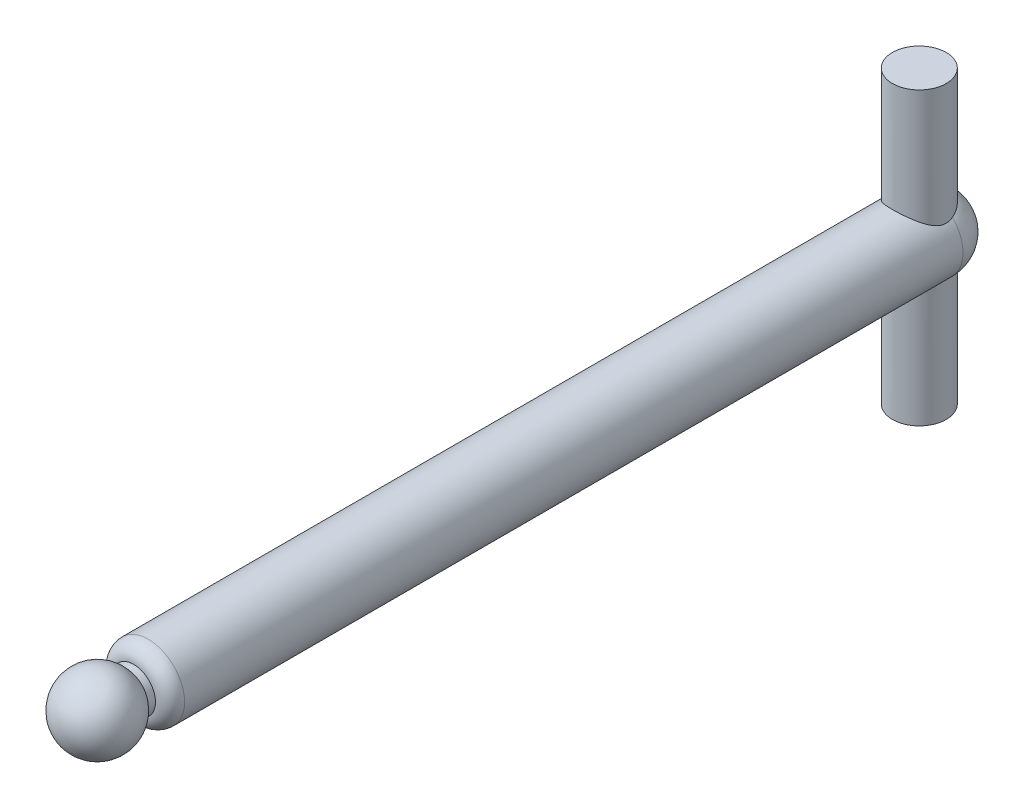
ISO-10303-21;
HEADER;
FILE_DESCRIPTION(('STEP AP214'),'2;1');
FILE_NAME('part.step','',(''),(''),'','','');
FILE_SCHEMA(('AUTOMOTIVE_DESIGN { 1 0 10303 214 1 1 1 1 }'));
ENDSEC;
DATA;
#1=APPLICATION_CONTEXT('core data for automotive mechanical design processes');
#2=APPLICATION_PROTOCOL_DEFINITION('international standard','automotive_design',2000,#1);
#3=PRODUCT_CONTEXT('',#1,'mechanical');
#4=PRODUCT('Part','Part','',(#3));
#5=PRODUCT_RELATED_PRODUCT_CATEGORY('part','',(#4));
#6=PRODUCT_DEFINITION_FORMATION('','',#4);
#7=PRODUCT_DEFINITION_CONTEXT('part definition',#1,'design');
#8=PRODUCT_DEFINITION('design','',#6,#7);
#9=PRODUCT_DEFINITION_SHAPE('','',#8);
#10=(LENGTH_UNIT() NAMED_UNIT(*) SI_UNIT(.MILLI.,.METRE.));
#11=(NAMED_UNIT(*) PLANE_ANGLE_UNIT() SI_UNIT($,.RADIAN.));
#12=(NAMED_UNIT(*) SI_UNIT($,.STERADIAN.) SOLID_ANGLE_UNIT());
#13=UNCERTAINTY_MEASURE_WITH_UNIT(LENGTH_MEASURE(1.E-05),#10,'distance_accuracy_value','');
#14=(GEOMETRIC_REPRESENTATION_CONTEXT(3) GLOBAL_UNCERTAINTY_ASSIGNED_CONTEXT((#13)) GLOBAL_UNIT_ASSIGNED_CONTEXT((#10,
#11,#12)) REPRESENTATION_CONTEXT('',''));
#15=CARTESIAN_POINT('',(0.,0.,0.));
#16=DIRECTION('',(0.,0.,1.));
#17=DIRECTION('',(1.,0.,0.));
#18=AXIS2_PLACEMENT_3D('',#15,#16,#17);
#19=CARTESIAN_POINT('',(0.,0.,59.5));
#20=DIRECTION('',(0.,0.,-1.));
#21=DIRECTION('',(1.,0.,0.));
#22=AXIS2_PLACEMENT_3D('',#19,#20,#21);
#23=SPHERICAL_SURFACE('',#22,2.5);
#24=CARTESIAN_POINT('',(0.,0.,57.5));
#25=DIRECTION('',(0.,0.,1.));
#26=DIRECTION('',(1.,0.,0.));
#27=AXIS2_PLACEMENT_3D('',#24,#25,#26);
#28=CIRCLE('',#27,1.5);
#29=CARTESIAN_POINT('',(1.5,0.,57.5));
#30=VERTEX_POINT('',#29);
#31=EDGE_CURVE('E11',#30,#30,#28,.F.);
#32=ORIENTED_EDGE('',*,*,#31,.F.);
#33=EDGE_LOOP('',(#32));
#34=FACE_BOUND('',#33,.T.);
#35=ADVANCED_FACE('F43',(#34),#23,.T.);
#36=CARTESIAN_POINT('',(0.,0.,54.7490704248776));
#37=DIRECTION('',(0.,0.,-1.));
#38=DIRECTION('',(-1.,0.,0.));
#39=AXIS2_PLACEMENT_3D('',#36,#37,#38);
#40=PLANE('',#39);
#41=CARTESIAN_POINT('',(0.,0.,54.7490704248776));
#42=DIRECTION('',(0.,0.,-1.));
#43=DIRECTION('',(-1.,0.,0.));
#44=AXIS2_PLACEMENT_3D('',#41,#42,#43);
#45=CIRCLE('',#44,1.5);
#46=CARTESIAN_POINT('',(-1.5,0.,54.7490704248776));
#47=VERTEX_POINT('',#46);
#48=EDGE_CURVE('E49',#47,#47,#45,.T.);
#49=ORIENTED_EDGE('',*,*,#48,.T.);
#50=EDGE_LOOP('',(#49));
#51=FACE_BOUND('',#50,.T.);
#52=ADVANCED_FACE('F55',(#51),#40,.T.);
#53=CARTESIAN_POINT('',(0.,0.,57.));
#54=DIRECTION('',(0.,0.,-1.));
#55=DIRECTION('',(-1.,0.,0.));
#56=AXIS2_PLACEMENT_3D('',#53,#54,#55);
#57=CYLINDRICAL_SURFACE('',#56,1.5);
#58=ORIENTED_EDGE('',*,*,#31,.T.);
#59=EDGE_LOOP('',(#58));
#60=FACE_BOUND('',#59,.T.);
#61=ORIENTED_EDGE('',*,*,#48,.F.);
#62=EDGE_LOOP('',(#61));
#63=FACE_BOUND('',#62,.T.);
#64=ADVANCED_FACE('F57',(#60,#63),#57,.T.);
#65=CLOSED_SHELL('',(#35,#52,#64));
#66=MANIFOLD_SOLID_BREP('B2',#65);
#67=CARTESIAN_POINT('',(0.,0.,57.));
#68=DIRECTION('',(0.,0.,-1.));
#69=DIRECTION('',(-1.,0.,0.));
#70=AXIS2_PLACEMENT_3D('',#67,#68,#69);
#71=CYLINDRICAL_SURFACE('',#70,2.5);
#72=CARTESIAN_POINT('',(0.,-2.5,4.85));
#73=CARTESIAN_POINT('',(0.0908037411005618,-2.50000387701624,4.85000414182973));
#74=CARTESIAN_POINT('',(0.181586856565063,-2.49501340434212,4.84327753480377));
#75=CARTESIAN_POINT('',(0.360194310265056,-2.47554724517431,4.81684174873592));
#76=CARTESIAN_POINT('',(0.448017631572467,-2.46106833287443,4.7971281544667));
#77=CARTESIAN_POINT('',(0.617816476306533,-2.42401075779856,4.7460339564));
#78=CARTESIAN_POINT('',(0.699819484177153,-2.40147368869752,4.71471323521834));
#79=CARTESIAN_POINT('',(0.856923811863363,-2.35000506142567,4.64185499930175));
#80=CARTESIAN_POINT('',(0.932024152393716,-2.32107259791315,4.60031603796321));
#81=CARTESIAN_POINT('',(1.08100282258564,-2.25580113417474,4.50416199278347));
#82=CARTESIAN_POINT('',(1.15413751679069,-2.21902623511381,4.44869710084186));
#83=CARTESIAN_POINT('',(1.29069231769546,-2.1424880792677,4.32849700726975));
#84=CARTESIAN_POINT('',(1.3540977041287,-2.10272042737369,4.26374803978792));
#85=CARTESIAN_POINT('',(1.48231472194717,-2.01491899975568,4.1121920365579));
#86=CARTESIAN_POINT('',(1.54492109406323,-1.96680693589834,4.02355561252696));
#87=CARTESIAN_POINT('',(1.65454189706459,-1.87551483927527,3.83478683265235));
#88=CARTESIAN_POINT('',(1.70157864027352,-1.83232780733836,3.73467120693063));
#89=CARTESIAN_POINT('',(1.76501686619427,-1.77086778102456,3.55922310480562));
#90=CARTESIAN_POINT('',(1.78639994566694,-1.74910566538276,3.48693105572161));
#91=CARTESIAN_POINT('',(1.82036398081376,-1.7137333366899,3.33845011099936));
#92=CARTESIAN_POINT('',(1.83296503133245,-1.70010452354241,3.26227054259241));
#93=CARTESIAN_POINT('',(1.84855248437103,-1.68315264087127,3.10709233533062));
#94=CARTESIAN_POINT('',(1.85145948025082,-1.67991469384006,3.02807574735096));
#95=CARTESIAN_POINT('',(1.84715394119453,-1.68464452723504,2.87063866821601));
#96=CARTESIAN_POINT('',(1.83993519273003,-1.69261918813617,2.79221857278742));
#97=CARTESIAN_POINT('',(1.81481067069801,-1.71954038855883,2.63080964317656));
#98=CARTESIAN_POINT('',(1.79590101842848,-1.73951183908506,2.54815704643441));
#99=CARTESIAN_POINT('',(1.74795837905897,-1.78767691807979,2.38832957068304));
#100=CARTESIAN_POINT('',(1.71890099472936,-1.81589033495432,2.3111684373647));
#101=CARTESIAN_POINT('',(1.63958740487909,-1.88827191133527,2.13595043173789));
#102=CARTESIAN_POINT('',(1.58546481691831,-1.93450956015681,2.04051006784806));
#103=CARTESIAN_POINT('',(1.46208652721486,-2.02938131468566,1.86129289055596));
#104=CARTESIAN_POINT('',(1.39281274078821,-2.07801822999833,1.77753021313445));
#105=CARTESIAN_POINT('',(1.23860828976679,-2.17352568805819,1.62138807552877));
#106=CARTESIAN_POINT('',(1.15344666157652,-2.22035596466481,1.54921029645904));
#107=CARTESIAN_POINT('',(0.969101681735234,-2.30676108056195,1.42014805763366));
#108=CARTESIAN_POINT('',(0.869951047354383,-2.34635236783227,1.36322878762448));
#109=CARTESIAN_POINT('',(0.686437547780426,-2.40532512381139,1.27990965243991));
#110=CARTESIAN_POINT('',(0.604753557128842,-2.42728567387609,1.2494284113037));
#111=CARTESIAN_POINT('',(0.436259723251394,-2.46314287399148,1.20003763216507));
#112=CARTESIAN_POINT('',(0.349453732455603,-2.47704550160282,1.18111951578878));
#113=CARTESIAN_POINT('',(0.1726562398483,-2.49561990796897,1.15590337782855));
#114=CARTESIAN_POINT('',(0.0826529964801484,-2.50025307592049,1.14965814204996));
#115=CARTESIAN_POINT('',(-0.0972746053877477,-2.49972554491027,1.15037074877488));
#116=CARTESIAN_POINT('',(-0.187198966313853,-2.49456515857203,1.15732816983176));
#117=CARTESIAN_POINT('',(-0.358245071277375,-2.47559809437806,1.18309214263269));
#118=CARTESIAN_POINT('',(-0.439557650657773,-2.46237969395701,1.20109299280203));
#119=CARTESIAN_POINT('',(-0.597676583051945,-2.42885176111822,1.24726722438432));
#120=CARTESIAN_POINT('',(-0.674481981775963,-2.40854073328504,1.27544275107729));
#121=CARTESIAN_POINT('',(-0.827805535400965,-2.36043886159826,1.34326022029349));
#122=CARTESIAN_POINT('',(-0.903869992182026,-2.33220123435144,1.38360373297371));
#123=CARTESIAN_POINT('',(-1.04833308326245,-2.27093934183829,1.4733240178569));
#124=CARTESIAN_POINT('',(-1.11672736130087,-2.23791238065133,1.5227058818883));
#125=CARTESIAN_POINT('',(-1.25715775043202,-2.16263828931728,1.63917749908106));
#126=CARTESIAN_POINT('',(-1.32756528352806,-2.11981052291986,1.70785396620858));
#127=CARTESIAN_POINT('',(-1.4565575339626,-2.03334010477991,1.85520939885789));
#128=CARTESIAN_POINT('',(-1.51512976325952,-1.98969664483973,1.93389878837245));
#129=CARTESIAN_POINT('',(-1.6156686884501,-1.90878111419462,2.09425971851787));
#130=CARTESIAN_POINT('',(-1.65857186677125,-1.87127746657761,2.17522477930214));
#131=CARTESIAN_POINT('',(-1.73261717054205,-1.80293495367251,2.34496541981192));
#132=CARTESIAN_POINT('',(-1.76378345509034,-1.77208245435838,2.43372448655538));
#133=CARTESIAN_POINT('',(-1.80662948856402,-1.72823449695806,2.5953441629559));
#134=CARTESIAN_POINT('',(-1.82121897849959,-1.71271191751858,2.66673024725442));
#135=CARTESIAN_POINT('',(-1.84188151212421,-1.69047699322332,2.81202618441482));
#136=CARTESIAN_POINT('',(-1.84796895309747,-1.68374975566162,2.88593155314593));
#137=CARTESIAN_POINT('',(-1.85117366684881,-1.68022763681263,3.0344197784039));
#138=CARTESIAN_POINT('',(-1.84826288222371,-1.68346382238687,3.1090040295376));
#139=CARTESIAN_POINT('',(-1.83365828289283,-1.69935401295355,3.25631306629406));
#140=CARTESIAN_POINT('',(-1.82195242223173,-1.71202093430047,3.32903516007113));
#141=CARTESIAN_POINT('',(-1.78635459996089,-1.7492146223623,3.48980369573146));
#142=CARTESIAN_POINT('',(-1.76004846371157,-1.77600064790375,3.57677723375518));
#143=CARTESIAN_POINT('',(-1.69627237975545,-1.83701003674836,3.74377053384609));
#144=CARTESIAN_POINT('',(-1.65877478462615,-1.87125176130957,3.82377243330833));
#145=CARTESIAN_POINT('',(-1.56107806384767,-1.95403468107918,3.99919926181548));
#146=CARTESIAN_POINT('',(-1.4974440402703,-2.00379991511226,4.09213480402335));
#147=CARTESIAN_POINT('',(-1.3544289055526,-2.103123596557,4.26515616161268));
#148=CARTESIAN_POINT('',(-1.27503826591533,-2.15268190022473,4.34523414837743));
#149=CARTESIAN_POINT('',(-1.10081905959608,-2.24678421861618,4.49119001955959));
#150=CARTESIAN_POINT('',(-1.00593380501705,-2.29130876473617,4.55701361514183));
#151=CARTESIAN_POINT('',(-0.802375361391734,-2.37023800481386,4.67099169726627));
#152=CARTESIAN_POINT('',(-0.693735220592625,-2.40466631988959,4.71918749221087));
#153=CARTESIAN_POINT('',(-0.487957613261007,-2.45373938378234,4.78711184312141));
#154=CARTESIAN_POINT('',(-0.392652250176831,-2.4709210874987,4.81054107315195));
#155=CARTESIAN_POINT('',(-0.198220207953497,-2.49404314441457,4.84197447230654));
#156=CARTESIAN_POINT('',(-0.0990978211568789,-2.49999576885427,4.84999547985252));
#157=CARTESIAN_POINT('',(0.,-2.5,4.85));
#158=B_SPLINE_CURVE_WITH_KNOTS('',3,(#72,#73,#74,#75,#76,#77,#78,#79,#80,#81,#82,#83,#84,#85,
#86,#87,#88,#89,#90,#91,#92,#93,#94,#95,#96,#97,#98,#99,#100,#101,#102,#103,#104,#105,#106,#107,
#108,#109,#110,#111,#112,#113,#114,#115,#116,#117,#118,#119,#120,#121,#122,#123,#124,#125,#126,
#127,#128,#129,#130,#131,#132,#133,#134,#135,#136,#137,#138,#139,#140,#141,#142,#143,#144,#145,
#146,#147,#148,#149,#150,#151,#152,#153,#154,#155,#156,#157),.UNSPECIFIED.,.T.,.F.,(4,2,2,2,2,2,
2,2,2,2,2,2,2,2,2,2,2,2,2,2,2,2,2,2,2,2,2,2,2,2,2,2,2,2,2,2,2,2,2,2,2,2,4),(0.,
0.272006671725052,0.544105866178727,0.814820378481081,1.08557323811005,1.38115533668075,
1.67718032732562,2.03179266962076,2.38589460601553,2.62047932227766,2.8545254888537,
3.09048414291858,3.32658765323392,3.58648972414884,3.84702100424682,4.20237840203124,
4.55816229700147,4.91959079102965,5.28018757822172,5.54880713770459,5.81722717285043,
6.08676297029442,6.35629016393656,6.60816893561277,6.86010084571472,7.13093030443569,
7.40191280938673,7.72254306220105,8.04350988198216,8.33954399458902,8.63496537906834,
8.85756227031097,9.07978175929555,9.302694849889,9.52591380562473,9.80854391608466,
10.091878099134,10.459478396808,10.8273016744564,11.1965021111849,11.5648317471251,
11.8620086531731,12.1588606130305),.UNSPECIFIED.);
#159=CARTESIAN_POINT('',(-1.78115131305569,-1.75428047928488,2.5));
#160=VERTEX_POINT('',#159);
#161=CARTESIAN_POINT('',(1.78115131305569,-1.75428047928488,2.5));
#162=VERTEX_POINT('',#161);
#163=EDGE_CURVE('E118',#160,#162,#158,.T.);
#164=ORIENTED_EDGE('',*,*,#163,.T.);
#165=CARTESIAN_POINT('',(0.,0.,2.5));
#166=DIRECTION('',(0.,0.,-1.));
#167=DIRECTION('',(-1.,0.,0.));
#168=AXIS2_PLACEMENT_3D('',#165,#166,#167);
#169=CIRCLE('',#168,2.5);
#170=CARTESIAN_POINT('',(1.78115131305569,1.75428047928488,2.5));
#171=VERTEX_POINT('',#170);
#172=EDGE_CURVE('E121',#162,#171,#169,.F.);
#173=ORIENTED_EDGE('',*,*,#172,.T.);
#174=CARTESIAN_POINT('',(0.,2.5,4.85));
#175=CARTESIAN_POINT('',(-0.0908037411005616,2.50000387701624,4.85000414182973));
#176=CARTESIAN_POINT('',(-0.181586856565063,2.49501340434212,4.84327753480377));
#177=CARTESIAN_POINT('',(-0.360194310265056,2.47554724517431,4.81684174873592));
#178=CARTESIAN_POINT('',(-0.448017631572467,2.46106833287443,4.7971281544667));
#179=CARTESIAN_POINT('',(-0.617816476306533,2.42401075779856,4.7460339564));
#180=CARTESIAN_POINT('',(-0.699819484177153,2.40147368869752,4.71471323521834));
#181=CARTESIAN_POINT('',(-0.856923811863363,2.35000506142567,4.64185499930175));
#182=CARTESIAN_POINT('',(-0.932024152393715,2.32107259791315,4.60031603796321));
#183=CARTESIAN_POINT('',(-1.08100282258564,2.25580113417474,4.50416199278347));
#184=CARTESIAN_POINT('',(-1.15413751679069,2.21902623511381,4.44869710084186));
#185=CARTESIAN_POINT('',(-1.29069231769546,2.1424880792677,4.32849700726975));
#186=CARTESIAN_POINT('',(-1.3540977041287,2.10272042737369,4.26374803978792));
#187=CARTESIAN_POINT('',(-1.48231472194717,2.01491899975568,4.1121920365579));
#188=CARTESIAN_POINT('',(-1.54492109406323,1.96680693589834,4.02355561252696));
#189=CARTESIAN_POINT('',(-1.65454189706459,1.87551483927527,3.83478683265235));
#190=CARTESIAN_POINT('',(-1.70157864027352,1.83232780733836,3.73467120693063));
#191=CARTESIAN_POINT('',(-1.76501686619427,1.77086778102456,3.55922310480562));
#192=CARTESIAN_POINT('',(-1.78639994566694,1.74910566538276,3.48693105572161));
#193=CARTESIAN_POINT('',(-1.82036398081376,1.7137333366899,3.33845011099936));
#194=CARTESIAN_POINT('',(-1.83296503133245,1.70010452354241,3.26227054259241));
#195=CARTESIAN_POINT('',(-1.84855248437103,1.68315264087127,3.10709233533062));
#196=CARTESIAN_POINT('',(-1.85145948025082,1.67991469384006,3.02807574735096));
#197=CARTESIAN_POINT('',(-1.84715394119453,1.68464452723504,2.87063866821601));
#198=CARTESIAN_POINT('',(-1.83993519273003,1.69261918813617,2.79221857278742));
#199=CARTESIAN_POINT('',(-1.81481067069801,1.71954038855883,2.63080964317656));
#200=CARTESIAN_POINT('',(-1.79590101842848,1.73951183908506,2.54815704643441));
#201=CARTESIAN_POINT('',(-1.74795837905897,1.78767691807979,2.38832957068304));
#202=CARTESIAN_POINT('',(-1.71890099472936,1.81589033495432,2.3111684373647));
#203=CARTESIAN_POINT('',(-1.63958740487909,1.88827191133527,2.13595043173789));
#204=CARTESIAN_POINT('',(-1.58546481691831,1.93450956015681,2.04051006784806));
#205=CARTESIAN_POINT('',(-1.46208652721486,2.02938131468566,1.86129289055596));
#206=CARTESIAN_POINT('',(-1.39281274078821,2.07801822999833,1.77753021313445));
#207=CARTESIAN_POINT('',(-1.23860828976679,2.17352568805819,1.62138807552877));
#208=CARTESIAN_POINT('',(-1.15344666157652,2.22035596466481,1.54921029645904));
#209=CARTESIAN_POINT('',(-0.969101681735234,2.30676108056195,1.42014805763366));
#210=CARTESIAN_POINT('',(-0.869951047354383,2.34635236783227,1.36322878762448));
#211=CARTESIAN_POINT('',(-0.686437547780426,2.40532512381139,1.27990965243991));
#212=CARTESIAN_POINT('',(-0.604753557128842,2.42728567387609,1.2494284113037));
#213=CARTESIAN_POINT('',(-0.436259723251394,2.46314287399148,1.20003763216507));
#214=CARTESIAN_POINT('',(-0.349453732455603,2.47704550160282,1.18111951578878));
#215=CARTESIAN_POINT('',(-0.1726562398483,2.49561990796897,1.15590337782855));
#216=CARTESIAN_POINT('',(-0.0826529964801484,2.50025307592049,1.14965814204996));
#217=CARTESIAN_POINT('',(0.0972746053877477,2.49972554491027,1.15037074877488));
#218=CARTESIAN_POINT('',(0.187198966313853,2.49456515857203,1.15732816983176));
#219=CARTESIAN_POINT('',(0.358245071277375,2.47559809437806,1.18309214263269));
#220=CARTESIAN_POINT('',(0.439557650657773,2.46237969395701,1.20109299280203));
#221=CARTESIAN_POINT('',(0.597676583051945,2.42885176111822,1.24726722438432));
#222=CARTESIAN_POINT('',(0.674481981775963,2.40854073328504,1.27544275107729));
#223=CARTESIAN_POINT('',(0.827805535400965,2.36043886159826,1.34326022029349));
#224=CARTESIAN_POINT('',(0.903869992182026,2.33220123435144,1.38360373297371));
#225=CARTESIAN_POINT('',(1.04833308326245,2.27093934183829,1.4733240178569));
#226=CARTESIAN_POINT('',(1.11672736130087,2.23791238065133,1.5227058818883));
#227=CARTESIAN_POINT('',(1.25715775043202,2.16263828931728,1.63917749908106));
#228=CARTESIAN_POINT('',(1.32756528352806,2.11981052291986,1.70785396620858));
#229=CARTESIAN_POINT('',(1.4565575339626,2.03334010477991,1.85520939885789));
#230=CARTESIAN_POINT('',(1.51512976325952,1.98969664483973,1.93389878837245));
#231=CARTESIAN_POINT('',(1.6156686884501,1.90878111419462,2.09425971851787));
#232=CARTESIAN_POINT('',(1.65857186677125,1.87127746657761,2.17522477930214));
#233=CARTESIAN_POINT('',(1.73261717054205,1.80293495367251,2.34496541981192));
#234=CARTESIAN_POINT('',(1.76378345509034,1.77208245435838,2.43372448655538));
#235=CARTESIAN_POINT('',(1.80662948856402,1.72823449695806,2.5953441629559));
#236=CARTESIAN_POINT('',(1.82121897849959,1.71271191751858,2.66673024725442));
#237=CARTESIAN_POINT('',(1.84188151212421,1.69047699322332,2.81202618441482));
#238=CARTESIAN_POINT('',(1.84796895309747,1.68374975566162,2.88593155314593));
#239=CARTESIAN_POINT('',(1.85117366684881,1.68022763681263,3.0344197784039));
#240=CARTESIAN_POINT('',(1.84826288222371,1.68346382238687,3.1090040295376));
#241=CARTESIAN_POINT('',(1.83365828289283,1.69935401295355,3.25631306629406));
#242=CARTESIAN_POINT('',(1.82195242223173,1.71202093430047,3.32903516007113));
#243=CARTESIAN_POINT('',(1.78635459996089,1.7492146223623,3.48980369573146));
#244=CARTESIAN_POINT('',(1.76004846371157,1.77600064790375,3.57677723375518));
#245=CARTESIAN_POINT('',(1.69627237975545,1.83701003674836,3.74377053384609));
#246=CARTESIAN_POINT('',(1.65877478462615,1.87125176130957,3.82377243330833));
#247=CARTESIAN_POINT('',(1.56107806384767,1.95403468107918,3.99919926181548));
#248=CARTESIAN_POINT('',(1.4974440402703,2.00379991511226,4.09213480402335));
#249=CARTESIAN_POINT('',(1.3544289055526,2.103123596557,4.26515616161268));
#250=CARTESIAN_POINT('',(1.27503826591533,2.15268190022473,4.34523414837743));
#251=CARTESIAN_POINT('',(1.10081905959608,2.24678421861618,4.49119001955959));
#252=CARTESIAN_POINT('',(1.00593380501705,2.29130876473617,4.55701361514183));
#253=CARTESIAN_POINT('',(0.802375361391734,2.37023800481386,4.67099169726627));
#254=CARTESIAN_POINT('',(0.693735220592625,2.40466631988959,4.71918749221087));
#255=CARTESIAN_POINT('',(0.487957613261007,2.45373938378234,4.78711184312141));
#256=CARTESIAN_POINT('',(0.392652250176831,2.4709210874987,4.81054107315195));
#257=CARTESIAN_POINT('',(0.198220207953497,2.49404314441457,4.84197447230654));
#258=CARTESIAN_POINT('',(0.0990978211568788,2.49999576885427,4.84999547985252));
#259=CARTESIAN_POINT('',(0.,2.5,4.85));
#260=B_SPLINE_CURVE_WITH_KNOTS('',3,(#174,#175,#176,#177,#178,#179,#180,#181,#182,#183,#184,
#185,#186,#187,#188,#189,#190,#191,#192,#193,#194,#195,#196,#197,#198,#199,#200,#201,#202,#203,
#204,#205,#206,#207,#208,#209,#210,#211,#212,#213,#214,#215,#216,#217,#218,#219,#220,#221,#222,
#223,#224,#225,#226,#227,#228,#229,#230,#231,#232,#233,#234,#235,#236,#237,#238,#239,#240,#241,
#242,#243,#244,#245,#246,#247,#248,#249,#250,#251,#252,#253,#254,#255,#256,#257,#258,#259),
.UNSPECIFIED.,.T.,.F.,(4,2,2,2,2,2,2,2,2,2,2,2,2,2,2,2,2,2,2,2,2,2,2,2,2,2,2,2,2,2,2,2,2,2,2,2,
2,2,2,2,2,2,4),(0.,0.272006671725051,0.544105866178727,0.814820378481081,1.08557323811005,
1.38115533668075,1.67718032732562,2.03179266962076,2.38589460601553,2.62047932227766,
2.8545254888537,3.09048414291858,3.32658765323392,3.58648972414884,3.84702100424682,
4.20237840203124,4.55816229700147,4.91959079102965,5.28018757822172,5.54880713770459,
5.81722717285043,6.08676297029442,6.35629016393656,6.60816893561277,6.86010084571472,
7.13093030443569,7.40191280938673,7.72254306220105,8.04350988198216,8.33954399458902,
8.63496537906834,8.85756227031097,9.07978175929555,9.302694849889,9.52591380562473,
9.80854391608466,10.091878099134,10.459478396808,10.8273016744564,11.1965021111849,
11.5648317471251,11.8620086531731,12.1588606130305),.UNSPECIFIED.);
#261=CARTESIAN_POINT('',(-1.78115131305569,1.75428047928488,2.5));
#262=VERTEX_POINT('',#261);
#263=EDGE_CURVE('E124',#171,#262,#260,.T.);
#264=ORIENTED_EDGE('',*,*,#263,.T.);
#265=CARTESIAN_POINT('',(0.,0.,2.5));
#266=DIRECTION('',(0.,0.,-1.));
#267=DIRECTION('',(-1.,0.,0.));
#268=AXIS2_PLACEMENT_3D('',#265,#266,#267);
#269=CIRCLE('',#268,2.5);
#270=EDGE_CURVE('E122',#262,#160,#269,.F.);
#271=ORIENTED_EDGE('',*,*,#270,.T.);
#272=EDGE_LOOP('',(#164,#173,#264,#271));
#273=FACE_BOUND('',#272,.T.);
#274=CARTESIAN_POINT('',(0.,0.,56.));
#275=DIRECTION('',(0.,0.,1.));
#276=DIRECTION('',(1.,0.,0.));
#277=AXIS2_PLACEMENT_3D('',#274,#275,#276);
#278=CIRCLE('',#277,2.5);
#279=CARTESIAN_POINT('',(2.5,0.,56.));
#280=VERTEX_POINT('',#279);
#281=EDGE_CURVE('E127',#280,#280,#278,.F.);
#282=ORIENTED_EDGE('',*,*,#281,.T.);
#283=EDGE_LOOP('',(#282));
#284=FACE_BOUND('',#283,.T.);
#285=ADVANCED_FACE('F84',(#273,#284),#71,.T.);
#286=CARTESIAN_POINT('',(0.,0.,57.));
#287=DIRECTION('',(0.,0.,1.));
#288=DIRECTION('',(1.,0.,0.));
#289=AXIS2_PLACEMENT_3D('',#286,#287,#288);
#290=PLANE('',#289);
#291=CARTESIAN_POINT('',(0.,0.,57.));
#292=DIRECTION('',(0.,0.,1.));
#293=DIRECTION('',(1.,0.,0.));
#294=AXIS2_PLACEMENT_3D('',#291,#292,#293);
#295=CIRCLE('',#294,1.5);
#296=CARTESIAN_POINT('',(1.5,0.,57.));
#297=VERTEX_POINT('',#296);
#298=EDGE_CURVE('E123',#297,#297,#295,.T.);
#299=ORIENTED_EDGE('',*,*,#298,.T.);
#300=EDGE_LOOP('',(#299));
#301=FACE_BOUND('',#300,.T.);
#302=ADVANCED_FACE('F140',(#301),#290,.T.);
#303=CARTESIAN_POINT('',(0.,0.,56.));
#304=DIRECTION('',(0.,0.,1.));
#305=DIRECTION('',(1.,0.,0.));
#306=AXIS2_PLACEMENT_3D('',#303,#304,#305);
#307=TOROIDAL_SURFACE('',#306,1.5,1.);
#308=ORIENTED_EDGE('',*,*,#281,.F.);
#309=EDGE_LOOP('',(#308));
#310=FACE_BOUND('',#309,.T.);
#311=ORIENTED_EDGE('',*,*,#298,.F.);
#312=EDGE_LOOP('',(#311));
#313=FACE_BOUND('',#312,.T.);
#314=ADVANCED_FACE('F153',(#310,#313),#307,.T.);
#315=CARTESIAN_POINT('',(0.,10.,3.));
#316=DIRECTION('',(0.,1.,0.));
#317=DIRECTION('',(0.,0.,1.));
#318=AXIS2_PLACEMENT_3D('',#315,#316,#317);
#319=PLANE('',#318);
#320=CARTESIAN_POINT('',(0.,10.,3.));
#321=DIRECTION('',(0.,1.,0.));
#322=DIRECTION('',(0.,0.,1.));
#323=AXIS2_PLACEMENT_3D('',#320,#321,#322);
#324=CIRCLE('',#323,1.85);
#325=CARTESIAN_POINT('',(0.,10.,4.85));
#326=VERTEX_POINT('',#325);
#327=EDGE_CURVE('E174',#326,#326,#324,.T.);
#328=ORIENTED_EDGE('',*,*,#327,.T.);
#329=EDGE_LOOP('',(#328));
#330=FACE_BOUND('',#329,.T.);
#331=ADVANCED_FACE('F156',(#330),#319,.T.);
#332=CARTESIAN_POINT('',(0.,-10.,3.));
#333=DIRECTION('',(0.,1.,0.));
#334=DIRECTION('',(0.,0.,1.));
#335=AXIS2_PLACEMENT_3D('',#332,#333,#334);
#336=CYLINDRICAL_SURFACE('',#335,1.85);
#337=ORIENTED_EDGE('',*,*,#327,.F.);
#338=EDGE_LOOP('',(#337));
#339=FACE_BOUND('',#338,.T.);
#340=ORIENTED_EDGE('',*,*,#263,.F.);
#341=CARTESIAN_POINT('',(1.78115131305569,1.75428047928488,2.5));
#342=CARTESIAN_POINT('',(1.76710058675012,1.76854587312827,2.44994941524433));
#343=CARTESIAN_POINT('',(1.75092225395561,1.78248611378104,2.40042805303476));
#344=CARTESIAN_POINT('',(1.71437249571935,1.80967652664199,2.30275573071063));
#345=CARTESIAN_POINT('',(1.69400055911865,1.82292661448042,2.25460493847022));
#346=CARTESIAN_POINT('',(1.6267078126766,1.8615686513401,2.1127248674637));
#347=CARTESIAN_POINT('',(1.57360100552128,1.88586154162609,2.02153550777989));
#348=CARTESIAN_POINT('',(1.45211214495975,1.93109222551692,1.84889646438568));
#349=CARTESIAN_POINT('',(1.38371030549637,1.95202561237912,1.76745960821967));
#350=CARTESIAN_POINT('',(1.2334670644207,1.99015969948988,1.61712787517141));
#351=CARTESIAN_POINT('',(1.15163478379201,2.00736291472274,1.54822455291677));
#352=CARTESIAN_POINT('',(0.978953771770452,2.03738571991971,1.42677974446236));
#353=CARTESIAN_POINT('',(0.888373638231622,2.05030199466579,1.37388017486995));
#354=CARTESIAN_POINT('',(0.699155081305317,2.07210457875492,1.28400184937293));
#355=CARTESIAN_POINT('',(0.600515789967888,2.08099045335759,1.24702481097885));
#356=CARTESIAN_POINT('',(0.400690139105801,2.09440530317934,1.19101034012447));
#357=CARTESIAN_POINT('',(0.29963099710197,2.09903863276843,1.1715434750478));
#358=CARTESIAN_POINT('',(0.0955943239700594,2.10425315558351,1.14962560375011));
#359=CARTESIAN_POINT('',(-0.0073828350662439,2.10483512672259,1.14717133089228));
#360=CARTESIAN_POINT('',(-0.210972538549858,2.10195735271765,1.15927718855156));
#361=CARTESIAN_POINT('',(-0.311598544150138,2.09854815818487,1.17362451696438));
#362=CARTESIAN_POINT('',(-0.508957749163906,2.08782608747991,1.21851082793729));
#363=CARTESIAN_POINT('',(-0.605690747751336,2.0805130101975,1.24905064465993));
#364=CARTESIAN_POINT('',(-0.792761366953206,2.0620806423645,1.325408269853));
#365=CARTESIAN_POINT('',(-0.883085566328297,2.05095363308856,1.3712570560728));
#366=CARTESIAN_POINT('',(-1.05468669850434,2.02507130178285,1.47675331044046));
#367=CARTESIAN_POINT('',(-1.13596392749522,2.01031609858776,1.53640032664935));
#368=CARTESIAN_POINT('',(-1.28860320967756,1.97713972179692,1.66869774307618));
#369=CARTESIAN_POINT('',(-1.35978683428904,1.95866393083068,1.74154002169259));
#370=CARTESIAN_POINT('',(-1.48893777127461,1.91847281862052,1.89736529126325));
#371=CARTESIAN_POINT('',(-1.54690352471252,1.89675711575551,1.98034947659871));
#372=CARTESIAN_POINT('',(-1.63745696319684,1.85537238923215,2.13542492880248));
#373=CARTESIAN_POINT('',(-1.67282054155944,1.83625494865695,2.20606364786178));
#374=CARTESIAN_POINT('',(-1.73411537163477,1.79642632655997,2.35074972678324));
#375=CARTESIAN_POINT('',(-1.76006216870444,1.77571784068498,2.42479123946031));
#376=CARTESIAN_POINT('',(-1.78115131305569,1.75428047928488,2.5));
#377=B_SPLINE_CURVE_WITH_KNOTS('',3,(#341,#342,#343,#344,#345,#346,#347,#348,#349,#350,#351,
#352,#353,#354,#355,#356,#357,#358,#359,#360,#361,#362,#363,#364,#365,#366,#367,#368,#369,#370,
#371,#372,#373,#374,#375,#376),.UNSPECIFIED.,.F.,.F.,(4,2,2,2,2,2,2,2,2,2,2,2,2,2,2,2,2,4),(0.,
0.161628733817914,0.323277180262845,0.646470798193981,0.970084951881879,1.29348023283485,
1.60898773186136,1.92452925511353,2.23210271213491,2.53961710945491,2.84327840664623,
3.14695534859141,3.45125054381999,3.75553577375676,4.06466472710674,4.37383012076827,
4.61704441861785,4.85985536866121),.UNSPECIFIED.);
#378=EDGE_CURVE('E97',#171,#262,#377,.T.);
#379=ORIENTED_EDGE('',*,*,#378,.T.);
#380=EDGE_LOOP('',(#340,#379));
#381=FACE_BOUND('',#380,.T.);
#382=ADVANCED_FACE('F137',(#339,#381),#336,.T.);
#383=CARTESIAN_POINT('',(0.,-10.,3.));
#384=DIRECTION('',(0.,1.,0.));
#385=DIRECTION('',(0.,0.,1.));
#386=AXIS2_PLACEMENT_3D('',#383,#384,#385);
#387=CIRCLE('',#386,1.85);
#388=CARTESIAN_POINT('',(0.,-10.,4.85));
#389=VERTEX_POINT('',#388);
#390=EDGE_CURVE('E171',#389,#389,#387,.T.);
#391=ORIENTED_EDGE('',*,*,#390,.T.);
#392=EDGE_LOOP('',(#391));
#393=FACE_BOUND('',#392,.T.);
#394=ORIENTED_EDGE('',*,*,#163,.F.);
#395=CARTESIAN_POINT('',(-1.78115131305569,-1.75428047928488,2.5));
#396=CARTESIAN_POINT('',(-1.76710058675012,-1.76854587312827,2.44994941524433));
#397=CARTESIAN_POINT('',(-1.75092225395561,-1.78248611378104,2.40042805303476));
#398=CARTESIAN_POINT('',(-1.71437249571935,-1.80967652664199,2.30275573071063));
#399=CARTESIAN_POINT('',(-1.69400055911865,-1.82292661448042,2.25460493847022));
#400=CARTESIAN_POINT('',(-1.6267078126766,-1.8615686513401,2.1127248674637));
#401=CARTESIAN_POINT('',(-1.57360100552128,-1.88586154162609,2.02153550777989));
#402=CARTESIAN_POINT('',(-1.45211214495975,-1.93109222551692,1.84889646438568));
#403=CARTESIAN_POINT('',(-1.38371030549637,-1.95202561237912,1.76745960821967));
#404=CARTESIAN_POINT('',(-1.2334670644207,-1.99015969948988,1.61712787517141));
#405=CARTESIAN_POINT('',(-1.15163478379201,-2.00736291472274,1.54822455291677));
#406=CARTESIAN_POINT('',(-0.978953771770452,-2.03738571991971,1.42677974446236));
#407=CARTESIAN_POINT('',(-0.888373638231622,-2.05030199466579,1.37388017486995));
#408=CARTESIAN_POINT('',(-0.699155081305317,-2.07210457875492,1.28400184937293));
#409=CARTESIAN_POINT('',(-0.600515789967888,-2.08099045335759,1.24702481097885));
#410=CARTESIAN_POINT('',(-0.400690139105801,-2.09440530317934,1.19101034012447));
#411=CARTESIAN_POINT('',(-0.29963099710197,-2.09903863276843,1.1715434750478));
#412=CARTESIAN_POINT('',(-0.0955943239700594,-2.10425315558351,1.14962560375011));
#413=CARTESIAN_POINT('',(0.0073828350662439,-2.10483512672259,1.14717133089228));
#414=CARTESIAN_POINT('',(0.210972538549858,-2.10195735271765,1.15927718855156));
#415=CARTESIAN_POINT('',(0.311598544150138,-2.09854815818487,1.17362451696438));
#416=CARTESIAN_POINT('',(0.508957749163906,-2.08782608747991,1.21851082793729));
#417=CARTESIAN_POINT('',(0.605690747751336,-2.0805130101975,1.24905064465993));
#418=CARTESIAN_POINT('',(0.792761366953206,-2.0620806423645,1.325408269853));
#419=CARTESIAN_POINT('',(0.883085566328297,-2.05095363308856,1.3712570560728));
#420=CARTESIAN_POINT('',(1.05468669850434,-2.02507130178285,1.47675331044046));
#421=CARTESIAN_POINT('',(1.13596392749522,-2.01031609858776,1.53640032664935));
#422=CARTESIAN_POINT('',(1.28860320967756,-1.97713972179692,1.66869774307618));
#423=CARTESIAN_POINT('',(1.35978683428904,-1.95866393083068,1.74154002169259));
#424=CARTESIAN_POINT('',(1.48893777127461,-1.91847281862052,1.89736529126325));
#425=CARTESIAN_POINT('',(1.54690352471252,-1.89675711575551,1.98034947659871));
#426=CARTESIAN_POINT('',(1.63745696319684,-1.85537238923215,2.13542492880248));
#427=CARTESIAN_POINT('',(1.67282054155944,-1.83625494865695,2.20606364786178));
#428=CARTESIAN_POINT('',(1.73411537163477,-1.79642632655997,2.35074972678324));
#429=CARTESIAN_POINT('',(1.76006216870444,-1.77571784068498,2.42479123946031));
#430=CARTESIAN_POINT('',(1.78115131305569,-1.75428047928488,2.5));
#431=B_SPLINE_CURVE_WITH_KNOTS('',3,(#395,#396,#397,#398,#399,#400,#401,#402,#403,#404,#405,
#406,#407,#408,#409,#410,#411,#412,#413,#414,#415,#416,#417,#418,#419,#420,#421,#422,#423,#424,
#425,#426,#427,#428,#429,#430),.UNSPECIFIED.,.F.,.F.,(4,2,2,2,2,2,2,2,2,2,2,2,2,2,2,2,2,4),(0.,
0.161628733817914,0.323277180262845,0.646470798193981,0.970084951881879,1.29348023283485,
1.60898773186136,1.92452925511353,2.23210271213491,2.53961710945491,2.84327840664623,
3.14695534859141,3.45125054381999,3.75553577375676,4.06466472710674,4.37383012076827,
4.61704441861785,4.85985536866121),.UNSPECIFIED.);
#432=EDGE_CURVE('E41',#160,#162,#431,.T.);
#433=ORIENTED_EDGE('',*,*,#432,.T.);
#434=EDGE_LOOP('',(#394,#433));
#435=FACE_BOUND('',#434,.T.);
#436=ADVANCED_FACE('F117',(#393,#435),#336,.T.);
#437=CARTESIAN_POINT('',(0.,-10.,3.));
#438=DIRECTION('',(0.,1.,0.));
#439=DIRECTION('',(0.,0.,1.));
#440=AXIS2_PLACEMENT_3D('',#437,#438,#439);
#441=PLANE('',#440);
#442=ORIENTED_EDGE('',*,*,#390,.F.);
#443=EDGE_LOOP('',(#442));
#444=FACE_BOUND('',#443,.T.);
#445=ADVANCED_FACE('F136',(#444),#441,.F.);
#446=CARTESIAN_POINT('',(0.,0.,2.5));
#447=DIRECTION('',(0.,0.,1.));
#448=DIRECTION('',(1.,0.,0.));
#449=AXIS2_PLACEMENT_3D('',#446,#447,#448);
#450=SPHERICAL_SURFACE('',#449,2.5);
#451=ORIENTED_EDGE('',*,*,#378,.F.);
#452=ORIENTED_EDGE('',*,*,#172,.F.);
#453=ORIENTED_EDGE('',*,*,#432,.F.);
#454=ORIENTED_EDGE('',*,*,#270,.F.);
#455=EDGE_LOOP('',(#451,#452,#453,#454));
#456=FACE_BOUND('',#455,.T.);
#457=ADVANCED_FACE('F86',(#456),#450,.T.);
#458=CLOSED_SHELL('',(#285,#302,#314,#331,#382,#436,#445,#457));
#459=MANIFOLD_SOLID_BREP('B6',#458);
#460=ADVANCED_BREP_SHAPE_REPRESENTATION('',(#18,#66,#459),#14);
#461=SHAPE_DEFINITION_REPRESENTATION(#9,#460);
ENDSEC;
END-ISO-10303-21;
